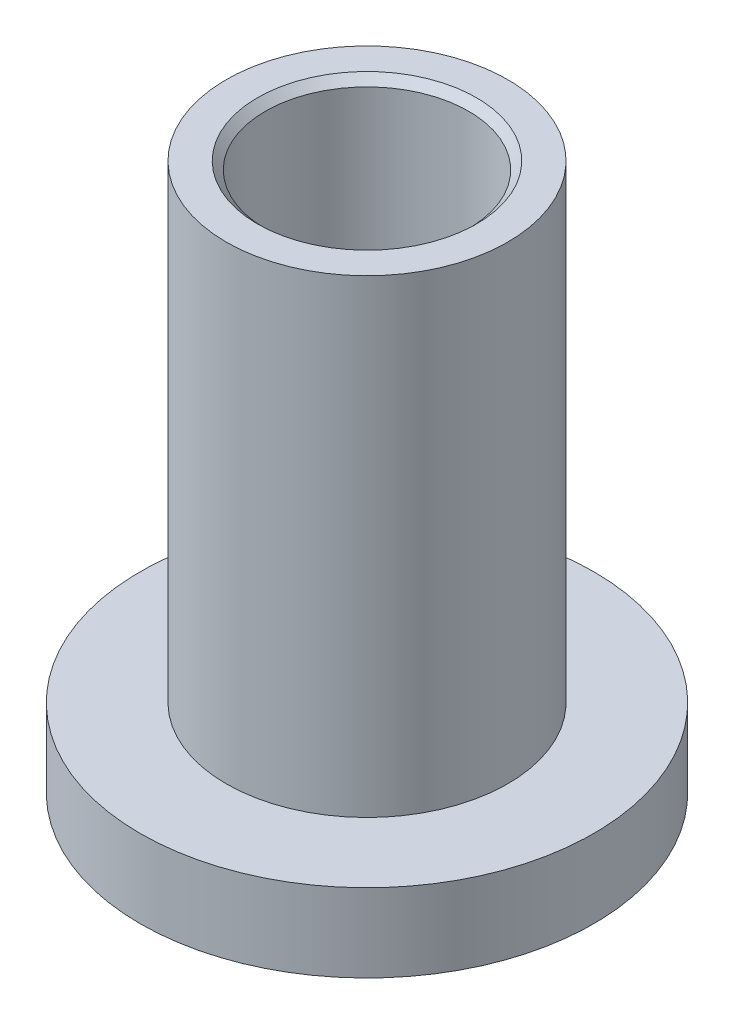
ISO-10303-21;
HEADER;
FILE_DESCRIPTION(('STEP AP214'),'2;1');
FILE_NAME('part.step','',(''),(''),'','','');
FILE_SCHEMA(('AUTOMOTIVE_DESIGN { 1 0 10303 214 1 1 1 1 }'));
ENDSEC;
DATA;
#1=APPLICATION_CONTEXT('core data for automotive mechanical design processes');
#2=APPLICATION_PROTOCOL_DEFINITION('international standard','automotive_design',2000,#1);
#3=PRODUCT_CONTEXT('',#1,'mechanical');
#4=PRODUCT('Part','Part','',(#3));
#5=PRODUCT_RELATED_PRODUCT_CATEGORY('part','',(#4));
#6=PRODUCT_DEFINITION_FORMATION('','',#4);
#7=PRODUCT_DEFINITION_CONTEXT('part definition',#1,'design');
#8=PRODUCT_DEFINITION('design','',#6,#7);
#9=PRODUCT_DEFINITION_SHAPE('','',#8);
#10=(LENGTH_UNIT() NAMED_UNIT(*) SI_UNIT(.MILLI.,.METRE.));
#11=(NAMED_UNIT(*) PLANE_ANGLE_UNIT() SI_UNIT($,.RADIAN.));
#12=(NAMED_UNIT(*) SI_UNIT($,.STERADIAN.) SOLID_ANGLE_UNIT());
#13=UNCERTAINTY_MEASURE_WITH_UNIT(LENGTH_MEASURE(1.E-05),#10,'distance_accuracy_value','');
#14=(GEOMETRIC_REPRESENTATION_CONTEXT(3) GLOBAL_UNCERTAINTY_ASSIGNED_CONTEXT((#13)) GLOBAL_UNIT_ASSIGNED_CONTEXT((#10,
#11,#12)) REPRESENTATION_CONTEXT('',''));
#15=CARTESIAN_POINT('',(0.,0.,0.));
#16=DIRECTION('',(0.,0.,1.));
#17=DIRECTION('',(1.,0.,0.));
#18=AXIS2_PLACEMENT_3D('',#15,#16,#17);
#19=CARTESIAN_POINT('',(0.,10.,0.));
#20=DIRECTION('',(0.,-1.,0.));
#21=DIRECTION('',(0.,0.,-1.));
#22=AXIS2_PLACEMENT_3D('',#19,#20,#21);
#23=CYLINDRICAL_SURFACE('',#22,29.);
#24=CARTESIAN_POINT('',(0.,10.,0.));
#25=DIRECTION('',(0.,1.,0.));
#26=DIRECTION('',(0.,0.,1.));
#27=AXIS2_PLACEMENT_3D('',#24,#25,#26);
#28=CIRCLE('',#27,29.);
#29=CARTESIAN_POINT('',(0.,10.,29.));
#30=VERTEX_POINT('',#29);
#31=EDGE_CURVE('E49',#30,#30,#28,.T.);
#32=ORIENTED_EDGE('',*,*,#31,.F.);
#33=EDGE_LOOP('',(#32));
#34=FACE_BOUND('',#33,.T.);
#35=CARTESIAN_POINT('',(0.,0.,0.));
#36=DIRECTION('',(0.,1.,0.));
#37=DIRECTION('',(0.,0.,1.));
#38=AXIS2_PLACEMENT_3D('',#35,#36,#37);
#39=CIRCLE('',#38,29.);
#40=CARTESIAN_POINT('',(0.,0.,29.));
#41=VERTEX_POINT('',#40);
#42=EDGE_CURVE('E52',#41,#41,#39,.T.);
#43=ORIENTED_EDGE('',*,*,#42,.T.);
#44=EDGE_LOOP('',(#43));
#45=FACE_BOUND('',#44,.T.);
#46=ADVANCED_FACE('F34',(#34,#45),#23,.T.);
#47=CARTESIAN_POINT('',(0.,10.,0.));
#48=DIRECTION('',(0.,1.,0.));
#49=DIRECTION('',(0.,0.,1.));
#50=AXIS2_PLACEMENT_3D('',#47,#48,#49);
#51=PLANE('',#50);
#52=CARTESIAN_POINT('',(0.,10.,0.));
#53=DIRECTION('',(0.,1.,0.));
#54=DIRECTION('',(0.,0.,1.));
#55=AXIS2_PLACEMENT_3D('',#52,#53,#54);
#56=CIRCLE('',#55,18.);
#57=CARTESIAN_POINT('',(0.,10.,18.));
#58=VERTEX_POINT('',#57);
#59=EDGE_CURVE('E58',#58,#58,#56,.T.);
#60=ORIENTED_EDGE('',*,*,#59,.F.);
#61=EDGE_LOOP('',(#60));
#62=FACE_BOUND('',#61,.T.);
#63=ORIENTED_EDGE('',*,*,#31,.T.);
#64=EDGE_LOOP('',(#63));
#65=FACE_BOUND('',#64,.T.);
#66=ADVANCED_FACE('F73',(#62,#65),#51,.T.);
#67=CARTESIAN_POINT('',(0.,0.,0.));
#68=DIRECTION('',(0.,1.,0.));
#69=DIRECTION('',(0.,0.,1.));
#70=AXIS2_PLACEMENT_3D('',#67,#68,#69);
#71=PLANE('',#70);
#72=ORIENTED_EDGE('',*,*,#42,.F.);
#73=EDGE_LOOP('',(#72));
#74=FACE_BOUND('',#73,.T.);
#75=ADVANCED_FACE('F76',(#74),#71,.F.);
#76=CARTESIAN_POINT('',(0.,70.,0.));
#77=DIRECTION('',(0.,1.,0.));
#78=DIRECTION('',(0.,0.,1.));
#79=AXIS2_PLACEMENT_3D('',#76,#77,#78);
#80=PLANE('',#79);
#81=CARTESIAN_POINT('',(0.,70.,0.));
#82=DIRECTION('',(0.,1.,0.));
#83=DIRECTION('',(0.,0.,1.));
#84=AXIS2_PLACEMENT_3D('',#81,#82,#83);
#85=CIRCLE('',#84,14.);
#86=CARTESIAN_POINT('',(0.,70.,14.));
#87=VERTEX_POINT('',#86);
#88=EDGE_CURVE('E10',#87,#87,#85,.F.);
#89=ORIENTED_EDGE('',*,*,#88,.T.);
#90=EDGE_LOOP('',(#89));
#91=FACE_BOUND('',#90,.T.);
#92=CARTESIAN_POINT('',(0.,70.,0.));
#93=DIRECTION('',(0.,1.,0.));
#94=DIRECTION('',(0.,0.,1.));
#95=AXIS2_PLACEMENT_3D('',#92,#93,#94);
#96=CIRCLE('',#95,18.);
#97=CARTESIAN_POINT('',(0.,70.,18.));
#98=VERTEX_POINT('',#97);
#99=EDGE_CURVE('E55',#98,#98,#96,.T.);
#100=ORIENTED_EDGE('',*,*,#99,.T.);
#101=EDGE_LOOP('',(#100));
#102=FACE_BOUND('',#101,.T.);
#103=ADVANCED_FACE('F64',(#91,#102),#80,.T.);
#104=CARTESIAN_POINT('',(0.,70.,0.));
#105=DIRECTION('',(0.,-1.,0.));
#106=DIRECTION('',(0.,0.,-1.));
#107=AXIS2_PLACEMENT_3D('',#104,#105,#106);
#108=CYLINDRICAL_SURFACE('',#107,18.);
#109=ORIENTED_EDGE('',*,*,#99,.F.);
#110=EDGE_LOOP('',(#109));
#111=FACE_BOUND('',#110,.T.);
#112=ORIENTED_EDGE('',*,*,#59,.T.);
#113=EDGE_LOOP('',(#112));
#114=FACE_BOUND('',#113,.T.);
#115=ADVANCED_FACE('F66',(#111,#114),#108,.T.);
#116=CARTESIAN_POINT('',(0.,70.,0.));
#117=DIRECTION('',(0.,-1.,0.));
#118=DIRECTION('',(0.,0.,-1.));
#119=AXIS2_PLACEMENT_3D('',#116,#117,#118);
#120=CYLINDRICAL_SURFACE('',#119,13.);
#121=CARTESIAN_POINT('',(0.,69.,0.));
#122=DIRECTION('',(0.,1.,0.));
#123=DIRECTION('',(0.,0.,1.));
#124=AXIS2_PLACEMENT_3D('',#121,#122,#123);
#125=CIRCLE('',#124,13.);
#126=CARTESIAN_POINT('',(0.,69.,13.));
#127=VERTEX_POINT('',#126);
#128=EDGE_CURVE('E41',#127,#127,#125,.T.);
#129=ORIENTED_EDGE('',*,*,#128,.T.);
#130=EDGE_LOOP('',(#129));
#131=FACE_BOUND('',#130,.T.);
#132=CARTESIAN_POINT('',(0.,10.,0.));
#133=DIRECTION('',(0.,1.,0.));
#134=DIRECTION('',(0.,0.,1.));
#135=AXIS2_PLACEMENT_3D('',#132,#133,#134);
#136=CIRCLE('',#135,13.);
#137=CARTESIAN_POINT('',(0.,10.,13.));
#138=VERTEX_POINT('',#137);
#139=EDGE_CURVE('E45',#138,#138,#136,.F.);
#140=ORIENTED_EDGE('',*,*,#139,.T.);
#141=EDGE_LOOP('',(#140));
#142=FACE_BOUND('',#141,.T.);
#143=ADVANCED_FACE('F69',(#131,#142),#120,.F.);
#144=ORIENTED_EDGE('',*,*,#139,.F.);
#145=EDGE_LOOP('',(#144));
#146=FACE_BOUND('',#145,.T.);
#147=ADVANCED_FACE('F78',(#146),#51,.T.);
#148=CARTESIAN_POINT('',(0.,69.,0.));
#149=DIRECTION('',(0.,1.,0.));
#150=DIRECTION('',(0.,0.,1.));
#151=AXIS2_PLACEMENT_3D('',#148,#149,#150);
#152=CONICAL_SURFACE('',#151,13.,0.78539816339744);
#153=ORIENTED_EDGE('',*,*,#88,.F.);
#154=EDGE_LOOP('',(#153));
#155=FACE_BOUND('',#154,.T.);
#156=ORIENTED_EDGE('',*,*,#128,.F.);
#157=EDGE_LOOP('',(#156));
#158=FACE_BOUND('',#157,.T.);
#159=ADVANCED_FACE('F36',(#155,#158),#152,.F.);
#160=CLOSED_SHELL('',(#46,#66,#75,#103,#115,#143,#147,#159));
#161=MANIFOLD_SOLID_BREP('B2',#160);
#162=ADVANCED_BREP_SHAPE_REPRESENTATION('',(#18,#161),#14);
#163=SHAPE_DEFINITION_REPRESENTATION(#9,#162);
ENDSEC;
END-ISO-10303-21;
